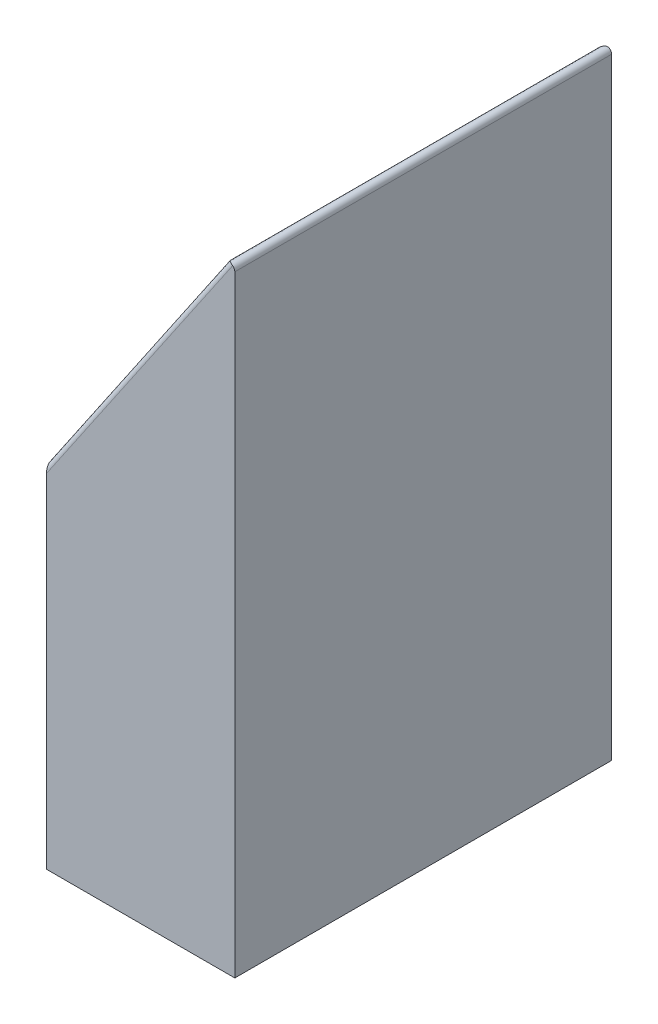
ISO-10303-21;
HEADER;
FILE_DESCRIPTION(('STEP AP214'),'2;1');
FILE_NAME('part.step','',(''),(''),'','','');
FILE_SCHEMA(('AUTOMOTIVE_DESIGN { 1 0 10303 214 1 1 1 1 }'));
ENDSEC;
DATA;
#1=APPLICATION_CONTEXT('core data for automotive mechanical design processes');
#2=APPLICATION_PROTOCOL_DEFINITION('international standard','automotive_design',2000,#1);
#3=PRODUCT_CONTEXT('',#1,'mechanical');
#4=PRODUCT('Part','Part','',(#3));
#5=PRODUCT_RELATED_PRODUCT_CATEGORY('part','',(#4));
#6=PRODUCT_DEFINITION_FORMATION('','',#4);
#7=PRODUCT_DEFINITION_CONTEXT('part definition',#1,'design');
#8=PRODUCT_DEFINITION('design','',#6,#7);
#9=PRODUCT_DEFINITION_SHAPE('','',#8);
#10=(LENGTH_UNIT() NAMED_UNIT(*) SI_UNIT(.MILLI.,.METRE.));
#11=(NAMED_UNIT(*) PLANE_ANGLE_UNIT() SI_UNIT($,.RADIAN.));
#12=(NAMED_UNIT(*) SI_UNIT($,.STERADIAN.) SOLID_ANGLE_UNIT());
#13=UNCERTAINTY_MEASURE_WITH_UNIT(LENGTH_MEASURE(1.E-05),#10,'distance_accuracy_value','');
#14=(GEOMETRIC_REPRESENTATION_CONTEXT(3) GLOBAL_UNCERTAINTY_ASSIGNED_CONTEXT((#13)) GLOBAL_UNIT_ASSIGNED_CONTEXT((#10,
#11,#12)) REPRESENTATION_CONTEXT('',''));
#15=CARTESIAN_POINT('',(0.,0.,0.));
#16=DIRECTION('',(0.,0.,1.));
#17=DIRECTION('',(1.,0.,0.));
#18=AXIS2_PLACEMENT_3D('',#15,#16,#17);
#19=CARTESIAN_POINT('',(0.,-500.,300.));
#20=DIRECTION('',(-1.,0.,0.));
#21=DIRECTION('',(0.,0.,1.));
#22=AXIS2_PLACEMENT_3D('',#19,#20,#21);
#23=PLANE('',#22);
#24=DIRECTION('',(0.,1.,0.));
#25=VECTOR('',#24,1.);
#26=CARTESIAN_POINT('',(0.,-500.,0.));
#27=LINE('',#26,#25);
#28=CARTESIAN_POINT('',(0.,-500.,0.));
#29=VERTEX_POINT('',#28);
#30=CARTESIAN_POINT('',(0.,-12.9672143763703,0.));
#31=VERTEX_POINT('',#30);
#32=EDGE_CURVE('E124',#29,#31,#27,.T.);
#33=ORIENTED_EDGE('',*,*,#32,.T.);
#34=DIRECTION('',(0.,0.,-1.));
#35=VECTOR('',#34,1.);
#36=CARTESIAN_POINT('',(0.,-12.9672143763703,300.));
#37=LINE('',#36,#35);
#38=CARTESIAN_POINT('',(0.,-12.9672143763703,300.));
#39=VERTEX_POINT('',#38);
#40=EDGE_CURVE('E11',#31,#39,#37,.F.);
#41=ORIENTED_EDGE('',*,*,#40,.T.);
#42=DIRECTION('',(0.,1.,0.));
#43=VECTOR('',#42,1.);
#44=CARTESIAN_POINT('',(0.,-500.,300.));
#45=LINE('',#44,#43);
#46=CARTESIAN_POINT('',(0.,-500.,300.));
#47=VERTEX_POINT('',#46);
#48=EDGE_CURVE('E106',#47,#39,#45,.T.);
#49=ORIENTED_EDGE('',*,*,#48,.F.);
#50=DIRECTION('',(0.,0.,-1.));
#51=VECTOR('',#50,1.);
#52=CARTESIAN_POINT('',(0.,-500.,300.));
#53=LINE('',#52,#51);
#54=EDGE_CURVE('E116',#47,#29,#53,.T.);
#55=ORIENTED_EDGE('',*,*,#54,.T.);
#56=EDGE_LOOP('',(#33,#41,#49,#55));
#57=FACE_BOUND('',#56,.T.);
#58=ADVANCED_FACE('F33',(#57),#23,.F.);
#59=CARTESIAN_POINT('',(0.,0.,300.));
#60=DIRECTION('',(0.826227342807548,-0.56333682464151,0.));
#61=DIRECTION('',(0.56333682464151,0.826227342807548,0.));
#62=AXIS2_PLACEMENT_3D('',#59,#60,#61);
#63=PLANE('',#62);
#64=DIRECTION('',(0.,0.,-1.));
#65=VECTOR('',#64,1.);
#66=CARTESIAN_POINT('',(-7.30490937123019,-10.7138670778043,300.));
#67=LINE('',#66,#65);
#68=CARTESIAN_POINT('',(-7.30490937123019,-10.7138670778043,296.));
#69=VERTEX_POINT('',#68);
#70=CARTESIAN_POINT('',(-7.30490937123019,-10.7138670778043,4.));
#71=VERTEX_POINT('',#70);
#72=EDGE_CURVE('E115',#69,#71,#67,.T.);
#73=ORIENTED_EDGE('',*,*,#72,.T.);
#74=DIRECTION('',(-0.56333682464151,-0.826227342807548,0.));
#75=VECTOR('',#74,1.);
#76=CARTESIAN_POINT('',(-150.,-220.,4.));
#77=LINE('',#76,#75);
#78=CARTESIAN_POINT('',(-149.30490937123,-218.980533744471,4.));
#79=VERTEX_POINT('',#78);
#80=EDGE_CURVE('E134',#71,#79,#77,.T.);
#81=ORIENTED_EDGE('',*,*,#80,.T.);
#82=DIRECTION('',(0.,0.,-1.));
#83=VECTOR('',#82,1.);
#84=CARTESIAN_POINT('',(-149.30490937123,-218.980533744471,300.));
#85=LINE('',#84,#83);
#86=CARTESIAN_POINT('',(-149.30490937123,-218.980533744471,296.));
#87=VERTEX_POINT('',#86);
#88=EDGE_CURVE('E132',#79,#87,#85,.F.);
#89=ORIENTED_EDGE('',*,*,#88,.T.);
#90=DIRECTION('',(-0.56333682464151,-0.826227342807548,0.));
#91=VECTOR('',#90,1.);
#92=CARTESIAN_POINT('',(0.,0.,296.));
#93=LINE('',#92,#91);
#94=EDGE_CURVE('E130',#87,#69,#93,.F.);
#95=ORIENTED_EDGE('',*,*,#94,.T.);
#96=EDGE_LOOP('',(#73,#81,#89,#95));
#97=FACE_BOUND('',#96,.T.);
#98=ADVANCED_FACE('F179',(#97),#63,.F.);
#99=CARTESIAN_POINT('',(-150.,-220.,300.));
#100=DIRECTION('',(1.,0.,0.));
#101=DIRECTION('',(0.,1.,0.));
#102=AXIS2_PLACEMENT_3D('',#99,#100,#101);
#103=PLANE('',#102);
#104=DIRECTION('',(0.,0.,-1.));
#105=VECTOR('',#104,1.);
#106=CARTESIAN_POINT('',(-150.,-221.233881043037,300.));
#107=LINE('',#106,#105);
#108=CARTESIAN_POINT('',(-150.,-221.233881043037,298.25334729857));
#109=VERTEX_POINT('',#108);
#110=CARTESIAN_POINT('',(-150.,-221.233881043037,1.74665270143043));
#111=VERTEX_POINT('',#110);
#112=EDGE_CURVE('E139',#109,#111,#107,.T.);
#113=ORIENTED_EDGE('',*,*,#112,.T.);
#114=CARTESIAN_POINT('',(-150.,-227.100547709704,4.));
#115=DIRECTION('',(1.,0.,0.));
#116=DIRECTION('',(0.,1.,0.));
#117=AXIS2_PLACEMENT_3D('',#114,#115,#116);
#118=ELLIPSE('',#117,7.10054770970365,4.);
#119=CARTESIAN_POINT('',(-150.,-227.100547709704,0.));
#120=VERTEX_POINT('',#119);
#121=EDGE_CURVE('E141',#111,#120,#118,.F.);
#122=ORIENTED_EDGE('',*,*,#121,.T.);
#123=DIRECTION('',(0.,-1.,0.));
#124=VECTOR('',#123,1.);
#125=CARTESIAN_POINT('',(-150.,-220.,0.));
#126=LINE('',#125,#124);
#127=CARTESIAN_POINT('',(-150.,-500.,0.));
#128=VERTEX_POINT('',#127);
#129=EDGE_CURVE('E112',#120,#128,#126,.T.);
#130=ORIENTED_EDGE('',*,*,#129,.T.);
#131=DIRECTION('',(0.,0.,-1.));
#132=VECTOR('',#131,1.);
#133=CARTESIAN_POINT('',(-150.,-500.,300.));
#134=LINE('',#133,#132);
#135=CARTESIAN_POINT('',(-150.,-500.,300.));
#136=VERTEX_POINT('',#135);
#137=EDGE_CURVE('E109',#136,#128,#134,.T.);
#138=ORIENTED_EDGE('',*,*,#137,.F.);
#139=DIRECTION('',(0.,-1.,0.));
#140=VECTOR('',#139,1.);
#141=CARTESIAN_POINT('',(-150.,-220.,300.));
#142=LINE('',#141,#140);
#143=CARTESIAN_POINT('',(-150.,-227.100547709704,300.));
#144=VERTEX_POINT('',#143);
#145=EDGE_CURVE('E98',#144,#136,#142,.T.);
#146=ORIENTED_EDGE('',*,*,#145,.F.);
#147=CARTESIAN_POINT('',(-150.,-227.100547709704,296.));
#148=DIRECTION('',(1.,0.,0.));
#149=DIRECTION('',(0.,-1.,0.));
#150=AXIS2_PLACEMENT_3D('',#147,#148,#149);
#151=ELLIPSE('',#150,7.10054770970365,4.);
#152=EDGE_CURVE('E137',#144,#109,#151,.F.);
#153=ORIENTED_EDGE('',*,*,#152,.T.);
#154=EDGE_LOOP('',(#113,#122,#130,#138,#146,#153));
#155=FACE_BOUND('',#154,.T.);
#156=ADVANCED_FACE('F110',(#155),#103,.F.);
#157=CARTESIAN_POINT('',(-150.,-500.,300.));
#158=DIRECTION('',(0.,1.,0.));
#159=DIRECTION('',(0.,0.,1.));
#160=AXIS2_PLACEMENT_3D('',#157,#158,#159);
#161=PLANE('',#160);
#162=DIRECTION('',(1.,0.,0.));
#163=VECTOR('',#162,1.);
#164=CARTESIAN_POINT('',(-150.,-500.,0.));
#165=LINE('',#164,#163);
#166=EDGE_CURVE('E127',#128,#29,#165,.T.);
#167=ORIENTED_EDGE('',*,*,#166,.T.);
#168=ORIENTED_EDGE('',*,*,#54,.F.);
#169=DIRECTION('',(1.,0.,0.));
#170=VECTOR('',#169,1.);
#171=CARTESIAN_POINT('',(-150.,-500.,300.));
#172=LINE('',#171,#170);
#173=EDGE_CURVE('E102',#136,#47,#172,.T.);
#174=ORIENTED_EDGE('',*,*,#173,.F.);
#175=ORIENTED_EDGE('',*,*,#137,.T.);
#176=EDGE_LOOP('',(#167,#168,#174,#175));
#177=FACE_BOUND('',#176,.T.);
#178=ADVANCED_FACE('F118',(#177),#161,.F.);
#179=CARTESIAN_POINT('',(0.,0.,300.));
#180=DIRECTION('',(0.,0.,-1.));
#181=DIRECTION('',(-1.,0.,0.));
#182=AXIS2_PLACEMENT_3D('',#179,#180,#181);
#183=PLANE('',#182);
#184=CARTESIAN_POINT('',(-4.,-12.9672143763703,300.));
#185=DIRECTION('',(0.,0.,-1.));
#186=DIRECTION('',(-1.,0.,0.));
#187=AXIS2_PLACEMENT_3D('',#184,#185,#186);
#188=CIRCLE('',#187,4.);
#189=CARTESIAN_POINT('',(-1.74665270143397,-9.66230500514012,300.));
#190=VERTEX_POINT('',#189);
#191=EDGE_CURVE('E50',#39,#190,#188,.F.);
#192=ORIENTED_EDGE('',*,*,#191,.T.);
#193=DIRECTION('',(-0.56333682464151,-0.826227342807548,0.));
#194=VECTOR('',#193,1.);
#195=CARTESIAN_POINT('',(3.30490937123018,-2.25334729856603,300.));
#196=LINE('',#195,#194);
#197=EDGE_CURVE('E42',#190,#144,#196,.T.);
#198=ORIENTED_EDGE('',*,*,#197,.T.);
#199=ORIENTED_EDGE('',*,*,#145,.T.);
#200=ORIENTED_EDGE('',*,*,#173,.T.);
#201=ORIENTED_EDGE('',*,*,#48,.T.);
#202=EDGE_LOOP('',(#192,#198,#199,#200,#201));
#203=FACE_BOUND('',#202,.T.);
#204=ADVANCED_FACE('F100',(#203),#183,.F.);
#205=CARTESIAN_POINT('',(0.,0.,0.));
#206=DIRECTION('',(0.,0.,-1.));
#207=DIRECTION('',(-1.,0.,0.));
#208=AXIS2_PLACEMENT_3D('',#205,#206,#207);
#209=PLANE('',#208);
#210=ORIENTED_EDGE('',*,*,#129,.F.);
#211=DIRECTION('',(-0.56333682464151,-0.826227342807548,0.));
#212=VECTOR('',#211,1.);
#213=CARTESIAN_POINT('',(3.30490937123019,-2.25334729856604,0.));
#214=LINE('',#213,#212);
#215=CARTESIAN_POINT('',(-1.74665270143396,-9.66230500514013,0.));
#216=VERTEX_POINT('',#215);
#217=EDGE_CURVE('E145',#120,#216,#214,.F.);
#218=ORIENTED_EDGE('',*,*,#217,.T.);
#219=CARTESIAN_POINT('',(-4.,-12.9672143763703,0.));
#220=DIRECTION('',(0.,0.,-1.));
#221=DIRECTION('',(-1.,0.,0.));
#222=AXIS2_PLACEMENT_3D('',#219,#220,#221);
#223=CIRCLE('',#222,4.);
#224=EDGE_CURVE('E143',#216,#31,#223,.T.);
#225=ORIENTED_EDGE('',*,*,#224,.T.);
#226=ORIENTED_EDGE('',*,*,#32,.F.);
#227=ORIENTED_EDGE('',*,*,#166,.F.);
#228=EDGE_LOOP('',(#210,#218,#225,#226,#227));
#229=FACE_BOUND('',#228,.T.);
#230=ADVANCED_FACE('F176',(#229),#209,.T.);
#231=CARTESIAN_POINT('',(3.30490937123019,-2.25334729856604,296.));
#232=DIRECTION('',(-0.56333682464151,-0.826227342807548,0.));
#233=DIRECTION('',(0.826227342807548,-0.56333682464151,0.));
#234=AXIS2_PLACEMENT_3D('',#231,#232,#233);
#235=CYLINDRICAL_SURFACE('',#234,4.);
#236=ORIENTED_EDGE('',*,*,#152,.F.);
#237=ORIENTED_EDGE('',*,*,#197,.F.);
#238=CARTESIAN_POINT('',(-4.,-12.9672143763703,296.));
#239=DIRECTION('',(0.398339288796109,0.584230956900959,-0.707106781186547));
#240=DIRECTION('',(-0.398339288796109,-0.584230956900959,-0.707106781186547));
#241=AXIS2_PLACEMENT_3D('',#238,#239,#240);
#242=ELLIPSE('',#241,5.65685424949238,4.);
#243=EDGE_CURVE('E37',#69,#190,#242,.T.);
#244=ORIENTED_EDGE('',*,*,#243,.F.);
#245=ORIENTED_EDGE('',*,*,#94,.F.);
#246=CARTESIAN_POINT('',(-146.,-221.233881043037,296.));
#247=DIRECTION('',(-0.398339288796109,-0.584230956900959,-0.707106781186547));
#248=DIRECTION('',(-0.398339288796109,-0.584230956900959,0.707106781186547));
#249=AXIS2_PLACEMENT_3D('',#246,#247,#248);
#250=ELLIPSE('',#249,5.65685424949238,4.);
#251=EDGE_CURVE('E153',#109,#87,#250,.T.);
#252=ORIENTED_EDGE('',*,*,#251,.F.);
#253=EDGE_LOOP('',(#236,#237,#244,#245,#252));
#254=FACE_BOUND('',#253,.T.);
#255=ADVANCED_FACE('F35',(#254),#235,.T.);
#256=CARTESIAN_POINT('',(-4.,-12.9672143763703,300.));
#257=DIRECTION('',(0.,0.,-1.));
#258=DIRECTION('',(-1.,0.,0.));
#259=AXIS2_PLACEMENT_3D('',#256,#257,#258);
#260=CYLINDRICAL_SURFACE('',#259,4.);
#261=ORIENTED_EDGE('',*,*,#40,.F.);
#262=ORIENTED_EDGE('',*,*,#224,.F.);
#263=CARTESIAN_POINT('',(-4.,-12.9672143763703,4.));
#264=DIRECTION('',(-0.398339288796109,-0.584230956900959,-0.707106781186547));
#265=DIRECTION('',(0.398339288796109,0.584230956900959,-0.707106781186547));
#266=AXIS2_PLACEMENT_3D('',#263,#264,#265);
#267=ELLIPSE('',#266,5.65685424949238,4.);
#268=EDGE_CURVE('E152',#71,#216,#267,.T.);
#269=ORIENTED_EDGE('',*,*,#268,.F.);
#270=ORIENTED_EDGE('',*,*,#72,.F.);
#271=ORIENTED_EDGE('',*,*,#243,.T.);
#272=ORIENTED_EDGE('',*,*,#191,.F.);
#273=EDGE_LOOP('',(#261,#262,#269,#270,#271,#272));
#274=FACE_BOUND('',#273,.T.);
#275=ADVANCED_FACE('F163',(#274),#260,.T.);
#276=CARTESIAN_POINT('',(-146.,-221.233881043037,300.));
#277=DIRECTION('',(0.,0.,-1.));
#278=DIRECTION('',(-1.,0.,0.));
#279=AXIS2_PLACEMENT_3D('',#276,#277,#278);
#280=CYLINDRICAL_SURFACE('',#279,4.);
#281=ORIENTED_EDGE('',*,*,#251,.T.);
#282=ORIENTED_EDGE('',*,*,#88,.F.);
#283=CARTESIAN_POINT('',(-146.,-221.233881043037,4.));
#284=DIRECTION('',(0.398339288796109,0.584230956900959,-0.707106781186547));
#285=DIRECTION('',(-0.398339288796109,-0.584230956900959,-0.707106781186547));
#286=AXIS2_PLACEMENT_3D('',#283,#284,#285);
#287=ELLIPSE('',#286,5.65685424949238,4.);
#288=EDGE_CURVE('E150',#111,#79,#287,.T.);
#289=ORIENTED_EDGE('',*,*,#288,.F.);
#290=ORIENTED_EDGE('',*,*,#112,.F.);
#291=EDGE_LOOP('',(#281,#282,#289,#290));
#292=FACE_BOUND('',#291,.T.);
#293=ADVANCED_FACE('F169',(#292),#280,.T.);
#294=CARTESIAN_POINT('',(3.30490937123019,-2.25334729856604,4.));
#295=DIRECTION('',(0.56333682464151,0.826227342807548,0.));
#296=DIRECTION('',(-0.826227342807548,0.56333682464151,0.));
#297=AXIS2_PLACEMENT_3D('',#294,#295,#296);
#298=CYLINDRICAL_SURFACE('',#297,4.);
#299=ORIENTED_EDGE('',*,*,#268,.T.);
#300=ORIENTED_EDGE('',*,*,#217,.F.);
#301=ORIENTED_EDGE('',*,*,#121,.F.);
#302=ORIENTED_EDGE('',*,*,#288,.T.);
#303=ORIENTED_EDGE('',*,*,#80,.F.);
#304=EDGE_LOOP('',(#299,#300,#301,#302,#303));
#305=FACE_BOUND('',#304,.T.);
#306=ADVANCED_FACE('F173',(#305),#298,.T.);
#307=CLOSED_SHELL('',(#58,#98,#156,#178,#204,#230,#255,#275,#293,#306));
#308=MANIFOLD_SOLID_BREP('B2',#307);
#309=ADVANCED_BREP_SHAPE_REPRESENTATION('',(#18,#308),#14);
#310=SHAPE_DEFINITION_REPRESENTATION(#9,#309);
ENDSEC;
END-ISO-10303-21;
